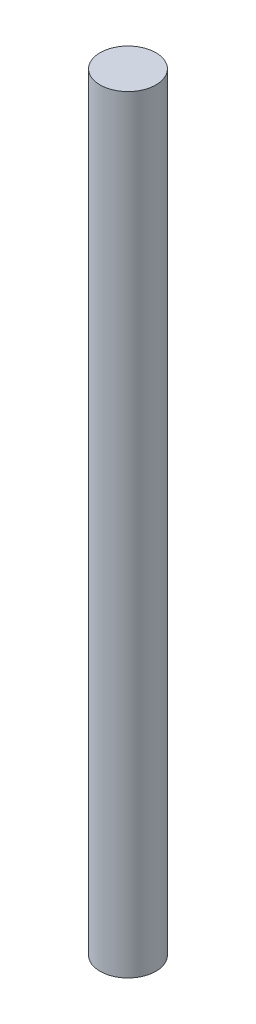
ISO-10303-21;
HEADER;
FILE_DESCRIPTION(('STEP AP214'),'2;1');
FILE_NAME('part.step','',(''),(''),'','','');
FILE_SCHEMA(('AUTOMOTIVE_DESIGN { 1 0 10303 214 1 1 1 1 }'));
ENDSEC;
DATA;
#1=APPLICATION_CONTEXT('core data for automotive mechanical design processes');
#2=APPLICATION_PROTOCOL_DEFINITION('international standard','automotive_design',2000,#1);
#3=PRODUCT_CONTEXT('',#1,'mechanical');
#4=PRODUCT('Part','Part','',(#3));
#5=PRODUCT_RELATED_PRODUCT_CATEGORY('part','',(#4));
#6=PRODUCT_DEFINITION_FORMATION('','',#4);
#7=PRODUCT_DEFINITION_CONTEXT('part definition',#1,'design');
#8=PRODUCT_DEFINITION('design','',#6,#7);
#9=PRODUCT_DEFINITION_SHAPE('','',#8);
#10=(LENGTH_UNIT() NAMED_UNIT(*) SI_UNIT(.MILLI.,.METRE.));
#11=(NAMED_UNIT(*) PLANE_ANGLE_UNIT() SI_UNIT($,.RADIAN.));
#12=(NAMED_UNIT(*) SI_UNIT($,.STERADIAN.) SOLID_ANGLE_UNIT());
#13=UNCERTAINTY_MEASURE_WITH_UNIT(LENGTH_MEASURE(1.E-05),#10,'distance_accuracy_value','');
#14=(GEOMETRIC_REPRESENTATION_CONTEXT(3) GLOBAL_UNCERTAINTY_ASSIGNED_CONTEXT((#13)) GLOBAL_UNIT_ASSIGNED_CONTEXT((#10,
#11,#12)) REPRESENTATION_CONTEXT('',''));
#15=CARTESIAN_POINT('',(0.,0.,0.));
#16=DIRECTION('',(0.,0.,1.));
#17=DIRECTION('',(1.,0.,0.));
#18=AXIS2_PLACEMENT_3D('',#15,#16,#17);
#19=CARTESIAN_POINT('',(0.,22.,0.));
#20=DIRECTION('',(0.,-1.,0.));
#21=DIRECTION('',(0.,0.,-1.));
#22=AXIS2_PLACEMENT_3D('',#19,#20,#21);
#23=CYLINDRICAL_SURFACE('',#22,0.8);
#24=CARTESIAN_POINT('',(0.,22.,0.));
#25=DIRECTION('',(0.,1.,0.));
#26=DIRECTION('',(0.,0.,1.));
#27=AXIS2_PLACEMENT_3D('',#24,#25,#26);
#28=CIRCLE('',#27,0.8);
#29=CARTESIAN_POINT('',(0.,22.,0.8));
#30=VERTEX_POINT('',#29);
#31=EDGE_CURVE('E10',#30,#30,#28,.T.);
#32=ORIENTED_EDGE('',*,*,#31,.F.);
#33=EDGE_LOOP('',(#32));
#34=FACE_BOUND('',#33,.T.);
#35=CARTESIAN_POINT('',(0.,0.,0.));
#36=DIRECTION('',(0.,1.,0.));
#37=DIRECTION('',(0.,0.,1.));
#38=AXIS2_PLACEMENT_3D('',#35,#36,#37);
#39=CIRCLE('',#38,0.8);
#40=CARTESIAN_POINT('',(0.,0.,0.8));
#41=VERTEX_POINT('',#40);
#42=EDGE_CURVE('E34',#41,#41,#39,.T.);
#43=ORIENTED_EDGE('',*,*,#42,.T.);
#44=EDGE_LOOP('',(#43));
#45=FACE_BOUND('',#44,.T.);
#46=ADVANCED_FACE('F31',(#34,#45),#23,.T.);
#47=CARTESIAN_POINT('',(0.,22.,0.));
#48=DIRECTION('',(0.,1.,0.));
#49=DIRECTION('',(0.,0.,1.));
#50=AXIS2_PLACEMENT_3D('',#47,#48,#49);
#51=PLANE('',#50);
#52=ORIENTED_EDGE('',*,*,#31,.T.);
#53=EDGE_LOOP('',(#52));
#54=FACE_BOUND('',#53,.T.);
#55=ADVANCED_FACE('F46',(#54),#51,.T.);
#56=CARTESIAN_POINT('',(0.,0.,0.));
#57=DIRECTION('',(0.,1.,0.));
#58=DIRECTION('',(0.,0.,1.));
#59=AXIS2_PLACEMENT_3D('',#56,#57,#58);
#60=PLANE('',#59);
#61=ORIENTED_EDGE('',*,*,#42,.F.);
#62=EDGE_LOOP('',(#61));
#63=FACE_BOUND('',#62,.T.);
#64=ADVANCED_FACE('F44',(#63),#60,.F.);
#65=CLOSED_SHELL('',(#46,#55,#64));
#66=MANIFOLD_SOLID_BREP('B2',#65);
#67=ADVANCED_BREP_SHAPE_REPRESENTATION('',(#18,#66),#14);
#68=SHAPE_DEFINITION_REPRESENTATION(#9,#67);
ENDSEC;
END-ISO-10303-21;
